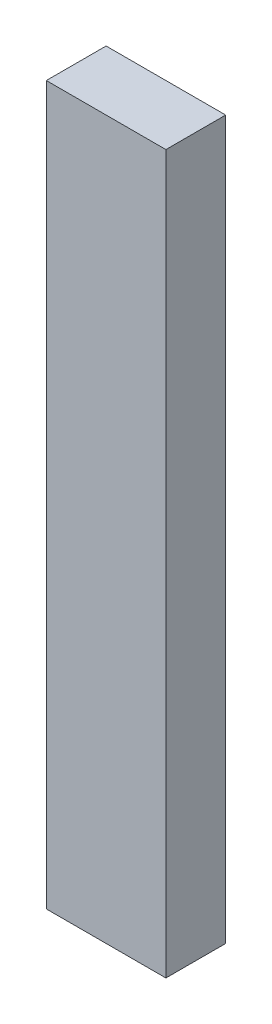
ISO-10303-21;
HEADER;
FILE_DESCRIPTION(('STEP AP214'),'2;1');
FILE_NAME('part.step','',(''),(''),'','','');
FILE_SCHEMA(('AUTOMOTIVE_DESIGN { 1 0 10303 214 1 1 1 1 }'));
ENDSEC;
DATA;
#1=APPLICATION_CONTEXT('core data for automotive mechanical design processes');
#2=APPLICATION_PROTOCOL_DEFINITION('international standard','automotive_design',2000,#1);
#3=PRODUCT_CONTEXT('',#1,'mechanical');
#4=PRODUCT('Part','Part','',(#3));
#5=PRODUCT_RELATED_PRODUCT_CATEGORY('part','',(#4));
#6=PRODUCT_DEFINITION_FORMATION('','',#4);
#7=PRODUCT_DEFINITION_CONTEXT('part definition',#1,'design');
#8=PRODUCT_DEFINITION('design','',#6,#7);
#9=PRODUCT_DEFINITION_SHAPE('','',#8);
#10=(LENGTH_UNIT() NAMED_UNIT(*) SI_UNIT(.MILLI.,.METRE.));
#11=(NAMED_UNIT(*) PLANE_ANGLE_UNIT() SI_UNIT($,.RADIAN.));
#12=(NAMED_UNIT(*) SI_UNIT($,.STERADIAN.) SOLID_ANGLE_UNIT());
#13=UNCERTAINTY_MEASURE_WITH_UNIT(LENGTH_MEASURE(1.E-05),#10,'distance_accuracy_value','');
#14=(GEOMETRIC_REPRESENTATION_CONTEXT(3) GLOBAL_UNCERTAINTY_ASSIGNED_CONTEXT((#13)) GLOBAL_UNIT_ASSIGNED_CONTEXT((#10,
#11,#12)) REPRESENTATION_CONTEXT('',''));
#15=CARTESIAN_POINT('',(0.,0.,0.));
#16=DIRECTION('',(0.,0.,1.));
#17=DIRECTION('',(1.,0.,0.));
#18=AXIS2_PLACEMENT_3D('',#15,#16,#17);
#19=CARTESIAN_POINT('',(0.,0.,2.5));
#20=DIRECTION('',(0.,0.,1.));
#21=DIRECTION('',(1.,0.,0.));
#22=AXIS2_PLACEMENT_3D('',#19,#20,#21);
#23=PLANE('',#22);
#24=DIRECTION('',(-1.,0.,0.));
#25=VECTOR('',#24,1.);
#26=CARTESIAN_POINT('',(0.,-30.,2.5));
#27=LINE('',#26,#25);
#28=CARTESIAN_POINT('',(5.,-30.,2.5));
#29=VERTEX_POINT('',#28);
#30=CARTESIAN_POINT('',(-5.,-30.,2.5));
#31=VERTEX_POINT('',#30);
#32=EDGE_CURVE('E10',#29,#31,#27,.T.);
#33=ORIENTED_EDGE('',*,*,#32,.F.);
#34=DIRECTION('',(0.,-1.,0.));
#35=VECTOR('',#34,1.);
#36=CARTESIAN_POINT('',(5.,0.,2.5));
#37=LINE('',#36,#35);
#38=CARTESIAN_POINT('',(5.,30.,2.5));
#39=VERTEX_POINT('',#38);
#40=EDGE_CURVE('E58',#39,#29,#37,.T.);
#41=ORIENTED_EDGE('',*,*,#40,.F.);
#42=DIRECTION('',(1.,0.,0.));
#43=VECTOR('',#42,1.);
#44=CARTESIAN_POINT('',(0.,30.,2.5));
#45=LINE('',#44,#43);
#46=CARTESIAN_POINT('',(-5.,30.,2.5));
#47=VERTEX_POINT('',#46);
#48=EDGE_CURVE('E88',#47,#39,#45,.T.);
#49=ORIENTED_EDGE('',*,*,#48,.F.);
#50=DIRECTION('',(0.,1.,0.));
#51=VECTOR('',#50,1.);
#52=CARTESIAN_POINT('',(-5.,0.,2.5));
#53=LINE('',#52,#51);
#54=EDGE_CURVE('E23',#31,#47,#53,.T.);
#55=ORIENTED_EDGE('',*,*,#54,.F.);
#56=EDGE_LOOP('',(#33,#41,#49,#55));
#57=FACE_BOUND('',#56,.T.);
#58=ADVANCED_FACE('F16',(#57),#23,.T.);
#59=CARTESIAN_POINT('',(0.,-30.,-2.5));
#60=DIRECTION('',(0.,-1.,0.));
#61=DIRECTION('',(0.,0.,-1.));
#62=AXIS2_PLACEMENT_3D('',#59,#60,#61);
#63=PLANE('',#62);
#64=DIRECTION('',(0.,0.,1.));
#65=VECTOR('',#64,1.);
#66=CARTESIAN_POINT('',(5.,-30.,-2.5));
#67=LINE('',#66,#65);
#68=CARTESIAN_POINT('',(5.,-30.,-2.5));
#69=VERTEX_POINT('',#68);
#70=EDGE_CURVE('E52',#69,#29,#67,.T.);
#71=ORIENTED_EDGE('',*,*,#70,.T.);
#72=ORIENTED_EDGE('',*,*,#32,.T.);
#73=DIRECTION('',(0.,0.,1.));
#74=VECTOR('',#73,1.);
#75=CARTESIAN_POINT('',(-5.,-30.,-2.5));
#76=LINE('',#75,#74);
#77=CARTESIAN_POINT('',(-5.,-30.,-2.5));
#78=VERTEX_POINT('',#77);
#79=EDGE_CURVE('E66',#78,#31,#76,.T.);
#80=ORIENTED_EDGE('',*,*,#79,.F.);
#81=DIRECTION('',(1.,0.,0.));
#82=VECTOR('',#81,1.);
#83=CARTESIAN_POINT('',(0.,-30.,-2.5));
#84=LINE('',#83,#82);
#85=EDGE_CURVE('E63',#78,#69,#84,.T.);
#86=ORIENTED_EDGE('',*,*,#85,.T.);
#87=EDGE_LOOP('',(#71,#72,#80,#86));
#88=FACE_BOUND('',#87,.T.);
#89=ADVANCED_FACE('F65',(#88),#63,.T.);
#90=CARTESIAN_POINT('',(-5.,0.,-2.5));
#91=DIRECTION('',(-1.,0.,0.));
#92=DIRECTION('',(0.,0.,1.));
#93=AXIS2_PLACEMENT_3D('',#90,#91,#92);
#94=PLANE('',#93);
#95=ORIENTED_EDGE('',*,*,#79,.T.);
#96=ORIENTED_EDGE('',*,*,#54,.T.);
#97=DIRECTION('',(0.,0.,1.));
#98=VECTOR('',#97,1.);
#99=CARTESIAN_POINT('',(-5.,30.,-2.5));
#100=LINE('',#99,#98);
#101=CARTESIAN_POINT('',(-5.,30.,-2.5));
#102=VERTEX_POINT('',#101);
#103=EDGE_CURVE('E81',#102,#47,#100,.T.);
#104=ORIENTED_EDGE('',*,*,#103,.F.);
#105=DIRECTION('',(0.,-1.,0.));
#106=VECTOR('',#105,1.);
#107=CARTESIAN_POINT('',(-5.,0.,-2.5));
#108=LINE('',#107,#106);
#109=EDGE_CURVE('E69',#102,#78,#108,.T.);
#110=ORIENTED_EDGE('',*,*,#109,.T.);
#111=EDGE_LOOP('',(#95,#96,#104,#110));
#112=FACE_BOUND('',#111,.T.);
#113=ADVANCED_FACE('F89',(#112),#94,.T.);
#114=CARTESIAN_POINT('',(0.,30.,-2.5));
#115=DIRECTION('',(0.,1.,0.));
#116=DIRECTION('',(0.,0.,1.));
#117=AXIS2_PLACEMENT_3D('',#114,#115,#116);
#118=PLANE('',#117);
#119=ORIENTED_EDGE('',*,*,#103,.T.);
#120=ORIENTED_EDGE('',*,*,#48,.T.);
#121=DIRECTION('',(0.,0.,1.));
#122=VECTOR('',#121,1.);
#123=CARTESIAN_POINT('',(5.,30.,-2.5));
#124=LINE('',#123,#122);
#125=CARTESIAN_POINT('',(5.,30.,-2.5));
#126=VERTEX_POINT('',#125);
#127=EDGE_CURVE('E61',#126,#39,#124,.T.);
#128=ORIENTED_EDGE('',*,*,#127,.F.);
#129=DIRECTION('',(-1.,0.,0.));
#130=VECTOR('',#129,1.);
#131=CARTESIAN_POINT('',(0.,30.,-2.5));
#132=LINE('',#131,#130);
#133=EDGE_CURVE('E74',#126,#102,#132,.T.);
#134=ORIENTED_EDGE('',*,*,#133,.T.);
#135=EDGE_LOOP('',(#119,#120,#128,#134));
#136=FACE_BOUND('',#135,.T.);
#137=ADVANCED_FACE('F86',(#136),#118,.T.);
#138=CARTESIAN_POINT('',(0.,0.,-2.5));
#139=DIRECTION('',(0.,0.,-1.));
#140=DIRECTION('',(-1.,0.,0.));
#141=AXIS2_PLACEMENT_3D('',#138,#139,#140);
#142=PLANE('',#141);
#143=DIRECTION('',(0.,1.,0.));
#144=VECTOR('',#143,1.);
#145=CARTESIAN_POINT('',(5.,0.,-2.5));
#146=LINE('',#145,#144);
#147=EDGE_CURVE('E59',#69,#126,#146,.T.);
#148=ORIENTED_EDGE('',*,*,#147,.F.);
#149=ORIENTED_EDGE('',*,*,#85,.F.);
#150=ORIENTED_EDGE('',*,*,#109,.F.);
#151=ORIENTED_EDGE('',*,*,#133,.F.);
#152=EDGE_LOOP('',(#148,#149,#150,#151));
#153=FACE_BOUND('',#152,.T.);
#154=ADVANCED_FACE('F73',(#153),#142,.T.);
#155=CARTESIAN_POINT('',(5.,0.,-2.5));
#156=DIRECTION('',(1.,0.,0.));
#157=DIRECTION('',(0.,0.,-1.));
#158=AXIS2_PLACEMENT_3D('',#155,#156,#157);
#159=PLANE('',#158);
#160=ORIENTED_EDGE('',*,*,#147,.T.);
#161=ORIENTED_EDGE('',*,*,#127,.T.);
#162=ORIENTED_EDGE('',*,*,#40,.T.);
#163=ORIENTED_EDGE('',*,*,#70,.F.);
#164=EDGE_LOOP('',(#160,#161,#162,#163));
#165=FACE_BOUND('',#164,.T.);
#166=ADVANCED_FACE('F54',(#165),#159,.T.);
#167=CLOSED_SHELL('',(#58,#89,#113,#137,#154,#166));
#168=MANIFOLD_SOLID_BREP('B1',#167);
#169=ADVANCED_BREP_SHAPE_REPRESENTATION('',(#18,#168),#14);
#170=SHAPE_DEFINITION_REPRESENTATION(#9,#169);
ENDSEC;
END-ISO-10303-21;
